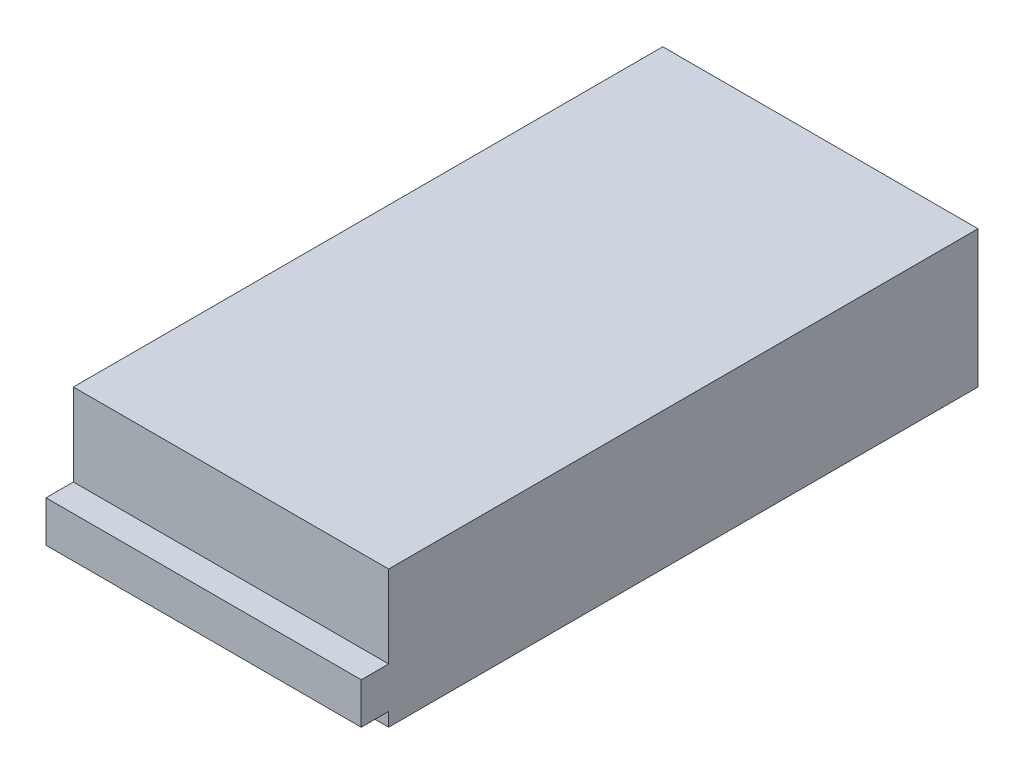
ISO-10303-21;
HEADER;
FILE_DESCRIPTION(('STEP AP214'),'2;1');
FILE_NAME('part.step','',(''),(''),'','','');
FILE_SCHEMA(('AUTOMOTIVE_DESIGN { 1 0 10303 214 1 1 1 1 }'));
ENDSEC;
DATA;
#1=APPLICATION_CONTEXT('core data for automotive mechanical design processes');
#2=APPLICATION_PROTOCOL_DEFINITION('international standard','automotive_design',2000,#1);
#3=PRODUCT_CONTEXT('',#1,'mechanical');
#4=PRODUCT('Part','Part','',(#3));
#5=PRODUCT_RELATED_PRODUCT_CATEGORY('part','',(#4));
#6=PRODUCT_DEFINITION_FORMATION('','',#4);
#7=PRODUCT_DEFINITION_CONTEXT('part definition',#1,'design');
#8=PRODUCT_DEFINITION('design','',#6,#7);
#9=PRODUCT_DEFINITION_SHAPE('','',#8);
#10=(LENGTH_UNIT() NAMED_UNIT(*) SI_UNIT(.MILLI.,.METRE.));
#11=(NAMED_UNIT(*) PLANE_ANGLE_UNIT() SI_UNIT($,.RADIAN.));
#12=(NAMED_UNIT(*) SI_UNIT($,.STERADIAN.) SOLID_ANGLE_UNIT());
#13=UNCERTAINTY_MEASURE_WITH_UNIT(LENGTH_MEASURE(1.E-05),#10,'distance_accuracy_value','');
#14=(GEOMETRIC_REPRESENTATION_CONTEXT(3) GLOBAL_UNCERTAINTY_ASSIGNED_CONTEXT((#13)) GLOBAL_UNIT_ASSIGNED_CONTEXT((#10,
#11,#12)) REPRESENTATION_CONTEXT('',''));
#15=CARTESIAN_POINT('',(0.,0.,0.));
#16=DIRECTION('',(0.,0.,1.));
#17=DIRECTION('',(1.,0.,0.));
#18=AXIS2_PLACEMENT_3D('',#15,#16,#17);
#19=CARTESIAN_POINT('',(0.,50.,0.));
#20=DIRECTION('',(0.,0.,-1.));
#21=DIRECTION('',(-1.,0.,0.));
#22=AXIS2_PLACEMENT_3D('',#19,#20,#21);
#23=PLANE('',#22);
#24=DIRECTION('',(-1.,0.,0.));
#25=VECTOR('',#24,1.);
#26=CARTESIAN_POINT('',(0.,20.,0.));
#27=LINE('',#26,#25);
#28=CARTESIAN_POINT('',(115.,20.,0.));
#29=VERTEX_POINT('',#28);
#30=CARTESIAN_POINT('',(0.,20.,0.));
#31=VERTEX_POINT('',#30);
#32=EDGE_CURVE('E116',#29,#31,#27,.T.);
#33=ORIENTED_EDGE('',*,*,#32,.F.);
#34=DIRECTION('',(0.,-1.,0.));
#35=VECTOR('',#34,1.);
#36=CARTESIAN_POINT('',(115.,50.,0.));
#37=LINE('',#36,#35);
#38=CARTESIAN_POINT('',(115.,50.,0.));
#39=VERTEX_POINT('',#38);
#40=EDGE_CURVE('E167',#39,#29,#37,.T.);
#41=ORIENTED_EDGE('',*,*,#40,.F.);
#42=DIRECTION('',(1.,0.,0.));
#43=VECTOR('',#42,1.);
#44=CARTESIAN_POINT('',(0.,50.,0.));
#45=LINE('',#44,#43);
#46=CARTESIAN_POINT('',(0.,50.,0.));
#47=VERTEX_POINT('',#46);
#48=EDGE_CURVE('E142',#47,#39,#45,.T.);
#49=ORIENTED_EDGE('',*,*,#48,.F.);
#50=DIRECTION('',(0.,-1.,0.));
#51=VECTOR('',#50,1.);
#52=CARTESIAN_POINT('',(0.,50.,0.));
#53=LINE('',#52,#51);
#54=EDGE_CURVE('E11',#47,#31,#53,.T.);
#55=ORIENTED_EDGE('',*,*,#54,.T.);
#56=EDGE_LOOP('',(#33,#41,#49,#55));
#57=FACE_BOUND('',#56,.T.);
#58=ADVANCED_FACE('F32',(#57),#23,.F.);
#59=DIRECTION('',(1.,0.,0.));
#60=VECTOR('',#59,1.);
#61=CARTESIAN_POINT('',(0.,5.,0.));
#62=LINE('',#61,#60);
#63=CARTESIAN_POINT('',(0.,5.,0.));
#64=VERTEX_POINT('',#63);
#65=CARTESIAN_POINT('',(115.,5.,0.));
#66=VERTEX_POINT('',#65);
#67=EDGE_CURVE('E49',#64,#66,#62,.T.);
#68=ORIENTED_EDGE('',*,*,#67,.F.);
#69=CARTESIAN_POINT('',(0.,0.,0.));
#70=VERTEX_POINT('',#69);
#71=EDGE_CURVE('E41',#64,#70,#53,.T.);
#72=ORIENTED_EDGE('',*,*,#71,.T.);
#73=DIRECTION('',(1.,0.,0.));
#74=VECTOR('',#73,1.);
#75=CARTESIAN_POINT('',(0.,0.,0.));
#76=LINE('',#75,#74);
#77=CARTESIAN_POINT('',(115.,0.,0.));
#78=VERTEX_POINT('',#77);
#79=EDGE_CURVE('E121',#70,#78,#76,.T.);
#80=ORIENTED_EDGE('',*,*,#79,.T.);
#81=EDGE_CURVE('E160',#66,#78,#37,.T.);
#82=ORIENTED_EDGE('',*,*,#81,.F.);
#83=EDGE_LOOP('',(#68,#72,#80,#82));
#84=FACE_BOUND('',#83,.T.);
#85=ADVANCED_FACE('F179',(#84),#23,.F.);
#86=CARTESIAN_POINT('',(0.,50.,0.));
#87=DIRECTION('',(1.,0.,0.));
#88=DIRECTION('',(0.,0.,-1.));
#89=AXIS2_PLACEMENT_3D('',#86,#87,#88);
#90=PLANE('',#89);
#91=DIRECTION('',(0.,0.,1.));
#92=VECTOR('',#91,1.);
#93=CARTESIAN_POINT('',(0.,0.,0.));
#94=LINE('',#93,#92);
#95=CARTESIAN_POINT('',(0.,0.,-215.));
#96=VERTEX_POINT('',#95);
#97=EDGE_CURVE('E119',#96,#70,#94,.T.);
#98=ORIENTED_EDGE('',*,*,#97,.T.);
#99=ORIENTED_EDGE('',*,*,#71,.F.);
#100=DIRECTION('',(0.,0.,-1.));
#101=VECTOR('',#100,1.);
#102=CARTESIAN_POINT('',(0.,5.,10.));
#103=LINE('',#102,#101);
#104=CARTESIAN_POINT('',(0.,5.,10.));
#105=VERTEX_POINT('',#104);
#106=EDGE_CURVE('E101',#105,#64,#103,.T.);
#107=ORIENTED_EDGE('',*,*,#106,.F.);
#108=DIRECTION('',(0.,-1.,0.));
#109=VECTOR('',#108,1.);
#110=CARTESIAN_POINT('',(0.,5.,10.));
#111=LINE('',#110,#109);
#112=CARTESIAN_POINT('',(0.,20.,10.));
#113=VERTEX_POINT('',#112);
#114=EDGE_CURVE('E107',#113,#105,#111,.T.);
#115=ORIENTED_EDGE('',*,*,#114,.F.);
#116=DIRECTION('',(0.,0.,-1.));
#117=VECTOR('',#116,1.);
#118=CARTESIAN_POINT('',(0.,20.,10.));
#119=LINE('',#118,#117);
#120=EDGE_CURVE('E132',#113,#31,#119,.T.);
#121=ORIENTED_EDGE('',*,*,#120,.T.);
#122=ORIENTED_EDGE('',*,*,#54,.F.);
#123=DIRECTION('',(0.,0.,1.));
#124=VECTOR('',#123,1.);
#125=CARTESIAN_POINT('',(0.,50.,0.));
#126=LINE('',#125,#124);
#127=CARTESIAN_POINT('',(0.,50.,-215.));
#128=VERTEX_POINT('',#127);
#129=EDGE_CURVE('E139',#128,#47,#126,.T.);
#130=ORIENTED_EDGE('',*,*,#129,.F.);
#131=DIRECTION('',(0.,-1.,0.));
#132=VECTOR('',#131,1.);
#133=CARTESIAN_POINT('',(0.,50.,-215.));
#134=LINE('',#133,#132);
#135=EDGE_CURVE('E148',#128,#96,#134,.T.);
#136=ORIENTED_EDGE('',*,*,#135,.T.);
#137=EDGE_LOOP('',(#98,#99,#107,#115,#121,#122,#130,#136));
#138=FACE_BOUND('',#137,.T.);
#139=ADVANCED_FACE('F34',(#138),#90,.F.);
#140=CARTESIAN_POINT('',(115.,50.,0.));
#141=DIRECTION('',(-1.,0.,0.));
#142=DIRECTION('',(0.,0.,1.));
#143=AXIS2_PLACEMENT_3D('',#140,#141,#142);
#144=PLANE('',#143);
#145=DIRECTION('',(0.,0.,-1.));
#146=VECTOR('',#145,1.);
#147=CARTESIAN_POINT('',(115.,0.,0.));
#148=LINE('',#147,#146);
#149=CARTESIAN_POINT('',(115.,0.,-215.));
#150=VERTEX_POINT('',#149);
#151=EDGE_CURVE('E152',#78,#150,#148,.T.);
#152=ORIENTED_EDGE('',*,*,#151,.T.);
#153=DIRECTION('',(0.,-1.,0.));
#154=VECTOR('',#153,1.);
#155=CARTESIAN_POINT('',(115.,50.,-215.));
#156=LINE('',#155,#154);
#157=CARTESIAN_POINT('',(115.,50.,-215.));
#158=VERTEX_POINT('',#157);
#159=EDGE_CURVE('E157',#158,#150,#156,.T.);
#160=ORIENTED_EDGE('',*,*,#159,.F.);
#161=DIRECTION('',(0.,0.,-1.));
#162=VECTOR('',#161,1.);
#163=CARTESIAN_POINT('',(115.,50.,0.));
#164=LINE('',#163,#162);
#165=EDGE_CURVE('E145',#39,#158,#164,.T.);
#166=ORIENTED_EDGE('',*,*,#165,.F.);
#167=ORIENTED_EDGE('',*,*,#40,.T.);
#168=DIRECTION('',(0.,0.,-1.));
#169=VECTOR('',#168,1.);
#170=CARTESIAN_POINT('',(115.,20.,10.));
#171=LINE('',#170,#169);
#172=CARTESIAN_POINT('',(115.,20.,10.));
#173=VERTEX_POINT('',#172);
#174=EDGE_CURVE('E123',#173,#29,#171,.T.);
#175=ORIENTED_EDGE('',*,*,#174,.F.);
#176=DIRECTION('',(0.,1.,0.));
#177=VECTOR('',#176,1.);
#178=CARTESIAN_POINT('',(115.,5.,10.));
#179=LINE('',#178,#177);
#180=CARTESIAN_POINT('',(115.,5.,10.));
#181=VERTEX_POINT('',#180);
#182=EDGE_CURVE('E106',#181,#173,#179,.T.);
#183=ORIENTED_EDGE('',*,*,#182,.F.);
#184=DIRECTION('',(0.,0.,-1.));
#185=VECTOR('',#184,1.);
#186=CARTESIAN_POINT('',(115.,5.,10.));
#187=LINE('',#186,#185);
#188=EDGE_CURVE('E103',#181,#66,#187,.T.);
#189=ORIENTED_EDGE('',*,*,#188,.T.);
#190=ORIENTED_EDGE('',*,*,#81,.T.);
#191=EDGE_LOOP('',(#152,#160,#166,#167,#175,#183,#189,#190));
#192=FACE_BOUND('',#191,.T.);
#193=ADVANCED_FACE('F175',(#192),#144,.F.);
#194=CARTESIAN_POINT('',(0.,50.,-215.));
#195=DIRECTION('',(0.,0.,1.));
#196=DIRECTION('',(1.,0.,0.));
#197=AXIS2_PLACEMENT_3D('',#194,#195,#196);
#198=PLANE('',#197);
#199=DIRECTION('',(-1.,0.,0.));
#200=VECTOR('',#199,1.);
#201=CARTESIAN_POINT('',(0.,0.,-215.));
#202=LINE('',#201,#200);
#203=EDGE_CURVE('E143',#150,#96,#202,.T.);
#204=ORIENTED_EDGE('',*,*,#203,.T.);
#205=ORIENTED_EDGE('',*,*,#135,.F.);
#206=DIRECTION('',(-1.,0.,0.));
#207=VECTOR('',#206,1.);
#208=CARTESIAN_POINT('',(0.,50.,-215.));
#209=LINE('',#208,#207);
#210=EDGE_CURVE('E147',#158,#128,#209,.T.);
#211=ORIENTED_EDGE('',*,*,#210,.F.);
#212=ORIENTED_EDGE('',*,*,#159,.T.);
#213=EDGE_LOOP('',(#204,#205,#211,#212));
#214=FACE_BOUND('',#213,.T.);
#215=ADVANCED_FACE('F186',(#214),#198,.F.);
#216=CARTESIAN_POINT('',(0.,50.,0.));
#217=DIRECTION('',(0.,-1.,0.));
#218=DIRECTION('',(0.,0.,-1.));
#219=AXIS2_PLACEMENT_3D('',#216,#217,#218);
#220=PLANE('',#219);
#221=ORIENTED_EDGE('',*,*,#129,.T.);
#222=ORIENTED_EDGE('',*,*,#48,.T.);
#223=ORIENTED_EDGE('',*,*,#165,.T.);
#224=ORIENTED_EDGE('',*,*,#210,.T.);
#225=EDGE_LOOP('',(#221,#222,#223,#224));
#226=FACE_BOUND('',#225,.T.);
#227=ADVANCED_FACE('F190',(#226),#220,.F.);
#228=CARTESIAN_POINT('',(0.,0.,0.));
#229=DIRECTION('',(0.,-1.,0.));
#230=DIRECTION('',(0.,0.,-1.));
#231=AXIS2_PLACEMENT_3D('',#228,#229,#230);
#232=PLANE('',#231);
#233=ORIENTED_EDGE('',*,*,#97,.F.);
#234=ORIENTED_EDGE('',*,*,#203,.F.);
#235=ORIENTED_EDGE('',*,*,#151,.F.);
#236=ORIENTED_EDGE('',*,*,#79,.F.);
#237=EDGE_LOOP('',(#233,#234,#235,#236));
#238=FACE_BOUND('',#237,.T.);
#239=ADVANCED_FACE('F183',(#238),#232,.T.);
#240=CARTESIAN_POINT('',(0.,5.,10.));
#241=DIRECTION('',(0.,1.,0.));
#242=DIRECTION('',(-1.,0.,0.));
#243=AXIS2_PLACEMENT_3D('',#240,#241,#242);
#244=PLANE('',#243);
#245=ORIENTED_EDGE('',*,*,#67,.T.);
#246=ORIENTED_EDGE('',*,*,#188,.F.);
#247=DIRECTION('',(1.,0.,0.));
#248=VECTOR('',#247,1.);
#249=CARTESIAN_POINT('',(0.,5.,10.));
#250=LINE('',#249,#248);
#251=EDGE_CURVE('E97',#105,#181,#250,.T.);
#252=ORIENTED_EDGE('',*,*,#251,.F.);
#253=ORIENTED_EDGE('',*,*,#106,.T.);
#254=EDGE_LOOP('',(#245,#246,#252,#253));
#255=FACE_BOUND('',#254,.T.);
#256=ADVANCED_FACE('F99',(#255),#244,.F.);
#257=CARTESIAN_POINT('',(0.,20.,10.));
#258=DIRECTION('',(0.,-1.,0.));
#259=DIRECTION('',(0.,0.,-1.));
#260=AXIS2_PLACEMENT_3D('',#257,#258,#259);
#261=PLANE('',#260);
#262=ORIENTED_EDGE('',*,*,#32,.T.);
#263=ORIENTED_EDGE('',*,*,#120,.F.);
#264=DIRECTION('',(-1.,0.,0.));
#265=VECTOR('',#264,1.);
#266=CARTESIAN_POINT('',(0.,20.,10.));
#267=LINE('',#266,#265);
#268=EDGE_CURVE('E112',#173,#113,#267,.T.);
#269=ORIENTED_EDGE('',*,*,#268,.F.);
#270=ORIENTED_EDGE('',*,*,#174,.T.);
#271=EDGE_LOOP('',(#262,#263,#269,#270));
#272=FACE_BOUND('',#271,.T.);
#273=ADVANCED_FACE('F192',(#272),#261,.F.);
#274=CARTESIAN_POINT('',(0.,0.,10.));
#275=DIRECTION('',(0.,0.,-1.));
#276=DIRECTION('',(-1.,0.,0.));
#277=AXIS2_PLACEMENT_3D('',#274,#275,#276);
#278=PLANE('',#277);
#279=ORIENTED_EDGE('',*,*,#114,.T.);
#280=ORIENTED_EDGE('',*,*,#251,.T.);
#281=ORIENTED_EDGE('',*,*,#182,.T.);
#282=ORIENTED_EDGE('',*,*,#268,.T.);
#283=EDGE_LOOP('',(#279,#280,#281,#282));
#284=FACE_BOUND('',#283,.T.);
#285=ADVANCED_FACE('F110',(#284),#278,.F.);
#286=CLOSED_SHELL('',(#58,#85,#139,#193,#215,#227,#239,#256,#273,#285));
#287=MANIFOLD_SOLID_BREP('B2',#286);
#288=ADVANCED_BREP_SHAPE_REPRESENTATION('',(#18,#287),#14);
#289=SHAPE_DEFINITION_REPRESENTATION(#9,#288);
ENDSEC;
END-ISO-10303-21;
